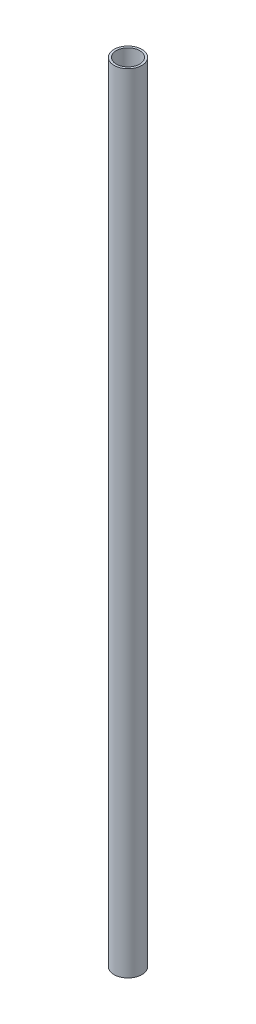
ISO-10303-21;
HEADER;
FILE_DESCRIPTION(('STEP AP214'),'2;1');
FILE_NAME('part.step','',(''),(''),'','','');
FILE_SCHEMA(('AUTOMOTIVE_DESIGN { 1 0 10303 214 1 1 1 1 }'));
ENDSEC;
DATA;
#1=APPLICATION_CONTEXT('core data for automotive mechanical design processes');
#2=APPLICATION_PROTOCOL_DEFINITION('international standard','automotive_design',2000,#1);
#3=PRODUCT_CONTEXT('',#1,'mechanical');
#4=PRODUCT('Part','Part','',(#3));
#5=PRODUCT_RELATED_PRODUCT_CATEGORY('part','',(#4));
#6=PRODUCT_DEFINITION_FORMATION('','',#4);
#7=PRODUCT_DEFINITION_CONTEXT('part definition',#1,'design');
#8=PRODUCT_DEFINITION('design','',#6,#7);
#9=PRODUCT_DEFINITION_SHAPE('','',#8);
#10=(LENGTH_UNIT() NAMED_UNIT(*) SI_UNIT(.MILLI.,.METRE.));
#11=(NAMED_UNIT(*) PLANE_ANGLE_UNIT() SI_UNIT($,.RADIAN.));
#12=(NAMED_UNIT(*) SI_UNIT($,.STERADIAN.) SOLID_ANGLE_UNIT());
#13=UNCERTAINTY_MEASURE_WITH_UNIT(LENGTH_MEASURE(1.E-05),#10,'distance_accuracy_value','');
#14=(GEOMETRIC_REPRESENTATION_CONTEXT(3) GLOBAL_UNCERTAINTY_ASSIGNED_CONTEXT((#13)) GLOBAL_UNIT_ASSIGNED_CONTEXT((#10,
#11,#12)) REPRESENTATION_CONTEXT('',''));
#15=CARTESIAN_POINT('',(0.,0.,0.));
#16=DIRECTION('',(0.,0.,1.));
#17=DIRECTION('',(1.,0.,0.));
#18=AXIS2_PLACEMENT_3D('',#15,#16,#17);
#19=CARTESIAN_POINT('',(0.,-900.,0.));
#20=DIRECTION('',(0.,1.,0.));
#21=DIRECTION('',(0.,0.,1.));
#22=AXIS2_PLACEMENT_3D('',#19,#20,#21);
#23=CYLINDRICAL_SURFACE('',#22,15.905);
#24=CARTESIAN_POINT('',(0.,-900.,0.));
#25=DIRECTION('',(0.,1.,0.));
#26=DIRECTION('',(0.,0.,1.));
#27=AXIS2_PLACEMENT_3D('',#24,#25,#26);
#28=CIRCLE('',#27,15.905);
#29=CARTESIAN_POINT('',(0.,-900.,15.905));
#30=VERTEX_POINT('',#29);
#31=EDGE_CURVE('E10',#30,#30,#28,.T.);
#32=ORIENTED_EDGE('',*,*,#31,.T.);
#33=EDGE_LOOP('',(#32));
#34=FACE_BOUND('',#33,.T.);
#35=CARTESIAN_POINT('',(0.,0.,0.));
#36=DIRECTION('',(0.,1.,0.));
#37=DIRECTION('',(0.,0.,1.));
#38=AXIS2_PLACEMENT_3D('',#35,#36,#37);
#39=CIRCLE('',#38,15.905);
#40=CARTESIAN_POINT('',(0.,0.,15.905));
#41=VERTEX_POINT('',#40);
#42=EDGE_CURVE('E38',#41,#41,#39,.T.);
#43=ORIENTED_EDGE('',*,*,#42,.F.);
#44=EDGE_LOOP('',(#43));
#45=FACE_BOUND('',#44,.T.);
#46=ADVANCED_FACE('F35',(#34,#45),#23,.T.);
#47=CARTESIAN_POINT('',(0.,-900.,0.));
#48=DIRECTION('',(0.,1.,0.));
#49=DIRECTION('',(0.,0.,1.));
#50=AXIS2_PLACEMENT_3D('',#47,#48,#49);
#51=PLANE('',#50);
#52=CARTESIAN_POINT('',(0.,-900.,0.));
#53=DIRECTION('',(0.,1.,0.));
#54=DIRECTION('',(0.,0.,1.));
#55=AXIS2_PLACEMENT_3D('',#52,#53,#54);
#56=CIRCLE('',#55,13.405);
#57=CARTESIAN_POINT('',(0.,-900.,13.405));
#58=VERTEX_POINT('',#57);
#59=EDGE_CURVE('E45',#58,#58,#56,.T.);
#60=ORIENTED_EDGE('',*,*,#59,.T.);
#61=EDGE_LOOP('',(#60));
#62=FACE_BOUND('',#61,.T.);
#63=ORIENTED_EDGE('',*,*,#31,.F.);
#64=EDGE_LOOP('',(#63));
#65=FACE_BOUND('',#64,.T.);
#66=ADVANCED_FACE('F53',(#62,#65),#51,.F.);
#67=CARTESIAN_POINT('',(0.,0.,0.));
#68=DIRECTION('',(0.,1.,0.));
#69=DIRECTION('',(0.,0.,1.));
#70=AXIS2_PLACEMENT_3D('',#67,#68,#69);
#71=PLANE('',#70);
#72=CARTESIAN_POINT('',(0.,0.,0.));
#73=DIRECTION('',(0.,1.,0.));
#74=DIRECTION('',(0.,0.,1.));
#75=AXIS2_PLACEMENT_3D('',#72,#73,#74);
#76=CIRCLE('',#75,13.405);
#77=CARTESIAN_POINT('',(0.,0.,13.405));
#78=VERTEX_POINT('',#77);
#79=EDGE_CURVE('E47',#78,#78,#76,.T.);
#80=ORIENTED_EDGE('',*,*,#79,.F.);
#81=EDGE_LOOP('',(#80));
#82=FACE_BOUND('',#81,.T.);
#83=ORIENTED_EDGE('',*,*,#42,.T.);
#84=EDGE_LOOP('',(#83));
#85=FACE_BOUND('',#84,.T.);
#86=ADVANCED_FACE('F59',(#82,#85),#71,.T.);
#87=CARTESIAN_POINT('',(0.,-900.,0.));
#88=DIRECTION('',(0.,1.,0.));
#89=DIRECTION('',(0.,0.,1.));
#90=AXIS2_PLACEMENT_3D('',#87,#88,#89);
#91=CYLINDRICAL_SURFACE('',#90,13.405);
#92=ORIENTED_EDGE('',*,*,#59,.F.);
#93=EDGE_LOOP('',(#92));
#94=FACE_BOUND('',#93,.T.);
#95=ORIENTED_EDGE('',*,*,#79,.T.);
#96=EDGE_LOOP('',(#95));
#97=FACE_BOUND('',#96,.T.);
#98=ADVANCED_FACE('F56',(#94,#97),#91,.F.);
#99=CLOSED_SHELL('',(#46,#66,#86,#98));
#100=MANIFOLD_SOLID_BREP('B2',#99);
#101=ADVANCED_BREP_SHAPE_REPRESENTATION('',(#18,#100),#14);
#102=SHAPE_DEFINITION_REPRESENTATION(#9,#101);
ENDSEC;
END-ISO-10303-21;
